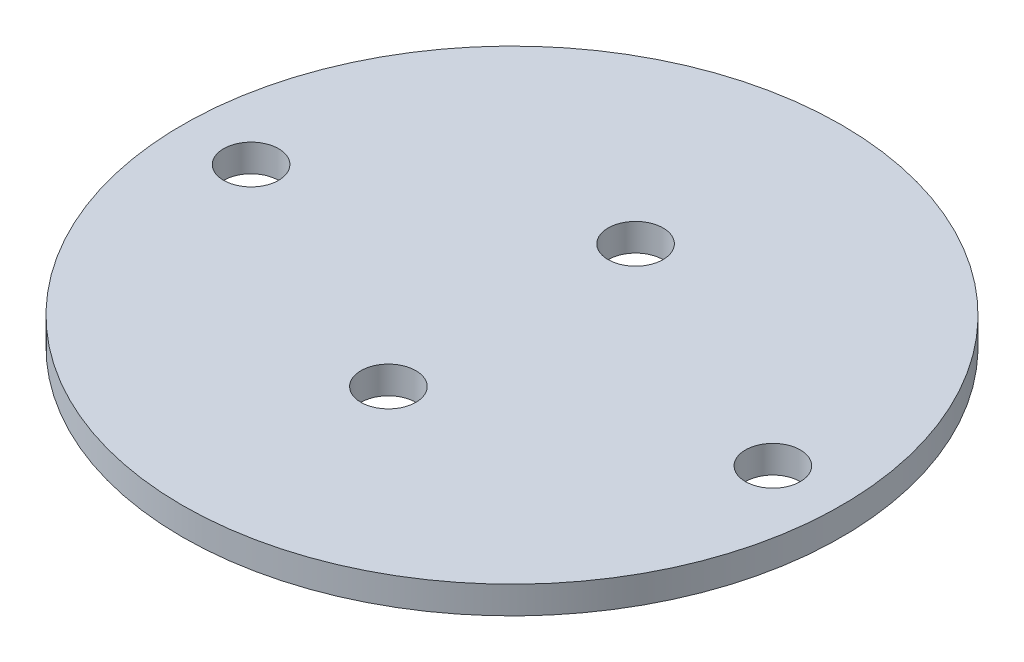
ISO-10303-21;
HEADER;
FILE_DESCRIPTION(('STEP AP214'),'2;1');
FILE_NAME('part.step','',(''),(''),'','','');
FILE_SCHEMA(('AUTOMOTIVE_DESIGN { 1 0 10303 214 1 1 1 1 }'));
ENDSEC;
DATA;
#1=APPLICATION_CONTEXT('core data for automotive mechanical design processes');
#2=APPLICATION_PROTOCOL_DEFINITION('international standard','automotive_design',2000,#1);
#3=PRODUCT_CONTEXT('',#1,'mechanical');
#4=PRODUCT('Part','Part','',(#3));
#5=PRODUCT_RELATED_PRODUCT_CATEGORY('part','',(#4));
#6=PRODUCT_DEFINITION_FORMATION('','',#4);
#7=PRODUCT_DEFINITION_CONTEXT('part definition',#1,'design');
#8=PRODUCT_DEFINITION('design','',#6,#7);
#9=PRODUCT_DEFINITION_SHAPE('','',#8);
#10=(LENGTH_UNIT() NAMED_UNIT(*) SI_UNIT(.MILLI.,.METRE.));
#11=(NAMED_UNIT(*) PLANE_ANGLE_UNIT() SI_UNIT($,.RADIAN.));
#12=(NAMED_UNIT(*) SI_UNIT($,.STERADIAN.) SOLID_ANGLE_UNIT());
#13=UNCERTAINTY_MEASURE_WITH_UNIT(LENGTH_MEASURE(1.E-05),#10,'distance_accuracy_value','');
#14=(GEOMETRIC_REPRESENTATION_CONTEXT(3) GLOBAL_UNCERTAINTY_ASSIGNED_CONTEXT((#13)) GLOBAL_UNIT_ASSIGNED_CONTEXT((#10,
#11,#12)) REPRESENTATION_CONTEXT('',''));
#15=CARTESIAN_POINT('',(0.,0.,0.));
#16=DIRECTION('',(0.,0.,1.));
#17=DIRECTION('',(1.,0.,0.));
#18=AXIS2_PLACEMENT_3D('',#15,#16,#17);
#19=CARTESIAN_POINT('',(32.4415047918678,-3.,0.));
#20=DIRECTION('',(0.,1.,0.));
#21=DIRECTION('',(0.,0.,1.));
#22=AXIS2_PLACEMENT_3D('',#19,#20,#21);
#23=CYLINDRICAL_SURFACE('',#22,3.);
#24=CARTESIAN_POINT('',(32.4415047918678,-3.,0.));
#25=DIRECTION('',(0.,1.,0.));
#26=DIRECTION('',(0.,0.,1.));
#27=AXIS2_PLACEMENT_3D('',#24,#25,#26);
#28=CIRCLE('',#27,3.);
#29=CARTESIAN_POINT('',(32.4415047918678,-3.,2.99999999999999));
#30=VERTEX_POINT('',#29);
#31=EDGE_CURVE('E46',#30,#30,#28,.T.);
#32=ORIENTED_EDGE('',*,*,#31,.F.);
#33=EDGE_LOOP('',(#32));
#34=FACE_BOUND('',#33,.T.);
#35=CARTESIAN_POINT('',(32.4415047918678,0.,0.));
#36=DIRECTION('',(0.,1.,0.));
#37=DIRECTION('',(0.,0.,1.));
#38=AXIS2_PLACEMENT_3D('',#35,#36,#37);
#39=CIRCLE('',#38,3.);
#40=CARTESIAN_POINT('',(32.4415047918678,0.,2.99999999999999));
#41=VERTEX_POINT('',#40);
#42=EDGE_CURVE('E67',#41,#41,#39,.T.);
#43=ORIENTED_EDGE('',*,*,#42,.T.);
#44=EDGE_LOOP('',(#43));
#45=FACE_BOUND('',#44,.T.);
#46=ADVANCED_FACE('F37',(#34,#45),#23,.F.);
#47=CARTESIAN_POINT('',(-24.5584952081322,-3.,0.));
#48=DIRECTION('',(0.,1.,0.));
#49=DIRECTION('',(0.,0.,1.));
#50=AXIS2_PLACEMENT_3D('',#47,#48,#49);
#51=CYLINDRICAL_SURFACE('',#50,3.);
#52=CARTESIAN_POINT('',(-24.5584952081322,-3.,0.));
#53=DIRECTION('',(0.,1.,0.));
#54=DIRECTION('',(0.,0.,1.));
#55=AXIS2_PLACEMENT_3D('',#52,#53,#54);
#56=CIRCLE('',#55,3.);
#57=CARTESIAN_POINT('',(-24.5584952081322,-3.,3.));
#58=VERTEX_POINT('',#57);
#59=EDGE_CURVE('E52',#58,#58,#56,.T.);
#60=ORIENTED_EDGE('',*,*,#59,.F.);
#61=EDGE_LOOP('',(#60));
#62=FACE_BOUND('',#61,.T.);
#63=CARTESIAN_POINT('',(-24.5584952081322,0.,0.));
#64=DIRECTION('',(0.,1.,0.));
#65=DIRECTION('',(0.,0.,1.));
#66=AXIS2_PLACEMENT_3D('',#63,#64,#65);
#67=CIRCLE('',#66,3.);
#68=CARTESIAN_POINT('',(-24.5584952081322,0.,3.));
#69=VERTEX_POINT('',#68);
#70=EDGE_CURVE('E64',#69,#69,#67,.T.);
#71=ORIENTED_EDGE('',*,*,#70,.T.);
#72=EDGE_LOOP('',(#71));
#73=FACE_BOUND('',#72,.T.);
#74=ADVANCED_FACE('F93',(#62,#73),#51,.F.);
#75=CARTESIAN_POINT('',(3.94150479186784,-3.,-13.5));
#76=DIRECTION('',(0.,1.,0.));
#77=DIRECTION('',(0.,0.,1.));
#78=AXIS2_PLACEMENT_3D('',#75,#76,#77);
#79=CYLINDRICAL_SURFACE('',#78,3.);
#80=CARTESIAN_POINT('',(3.94150479186784,-3.,-13.5));
#81=DIRECTION('',(0.,1.,0.));
#82=DIRECTION('',(0.,0.,1.));
#83=AXIS2_PLACEMENT_3D('',#80,#81,#82);
#84=CIRCLE('',#83,3.);
#85=CARTESIAN_POINT('',(3.94150479186784,-3.,-10.5));
#86=VERTEX_POINT('',#85);
#87=EDGE_CURVE('E79',#86,#86,#84,.T.);
#88=ORIENTED_EDGE('',*,*,#87,.F.);
#89=EDGE_LOOP('',(#88));
#90=FACE_BOUND('',#89,.T.);
#91=CARTESIAN_POINT('',(3.94150479186784,0.,-13.5));
#92=DIRECTION('',(0.,1.,0.));
#93=DIRECTION('',(0.,0.,1.));
#94=AXIS2_PLACEMENT_3D('',#91,#92,#93);
#95=CIRCLE('',#94,3.);
#96=CARTESIAN_POINT('',(3.94150479186784,0.,-10.5));
#97=VERTEX_POINT('',#96);
#98=EDGE_CURVE('E60',#97,#97,#95,.T.);
#99=ORIENTED_EDGE('',*,*,#98,.T.);
#100=EDGE_LOOP('',(#99));
#101=FACE_BOUND('',#100,.T.);
#102=ADVANCED_FACE('F96',(#90,#101),#79,.F.);
#103=CARTESIAN_POINT('',(3.94150479186784,-3.,13.5));
#104=DIRECTION('',(0.,1.,0.));
#105=DIRECTION('',(0.,0.,1.));
#106=AXIS2_PLACEMENT_3D('',#103,#104,#105);
#107=CYLINDRICAL_SURFACE('',#106,3.);
#108=CARTESIAN_POINT('',(3.94150479186784,-3.,13.5));
#109=DIRECTION('',(0.,1.,0.));
#110=DIRECTION('',(0.,0.,1.));
#111=AXIS2_PLACEMENT_3D('',#108,#109,#110);
#112=CIRCLE('',#111,3.);
#113=CARTESIAN_POINT('',(3.94150479186784,-3.,16.5));
#114=VERTEX_POINT('',#113);
#115=EDGE_CURVE('E74',#114,#114,#112,.T.);
#116=ORIENTED_EDGE('',*,*,#115,.F.);
#117=EDGE_LOOP('',(#116));
#118=FACE_BOUND('',#117,.T.);
#119=CARTESIAN_POINT('',(3.94150479186784,0.,13.5));
#120=DIRECTION('',(0.,1.,0.));
#121=DIRECTION('',(0.,0.,1.));
#122=AXIS2_PLACEMENT_3D('',#119,#120,#121);
#123=CIRCLE('',#122,3.);
#124=CARTESIAN_POINT('',(3.94150479186784,0.,16.5));
#125=VERTEX_POINT('',#124);
#126=EDGE_CURVE('E56',#125,#125,#123,.T.);
#127=ORIENTED_EDGE('',*,*,#126,.T.);
#128=EDGE_LOOP('',(#127));
#129=FACE_BOUND('',#128,.T.);
#130=ADVANCED_FACE('F39',(#118,#129),#107,.F.);
#131=CARTESIAN_POINT('',(3.94150479186784,-3.,0.));
#132=DIRECTION('',(0.,1.,0.));
#133=DIRECTION('',(0.,0.,1.));
#134=AXIS2_PLACEMENT_3D('',#131,#132,#133);
#135=CYLINDRICAL_SURFACE('',#134,36.);
#136=CARTESIAN_POINT('',(3.94150479186784,-3.,0.));
#137=DIRECTION('',(0.,1.,0.));
#138=DIRECTION('',(0.,0.,1.));
#139=AXIS2_PLACEMENT_3D('',#136,#137,#138);
#140=CIRCLE('',#139,36.);
#141=CARTESIAN_POINT('',(3.94150479186784,-3.,36.));
#142=VERTEX_POINT('',#141);
#143=EDGE_CURVE('E10',#142,#142,#140,.T.);
#144=ORIENTED_EDGE('',*,*,#143,.T.);
#145=EDGE_LOOP('',(#144));
#146=FACE_BOUND('',#145,.T.);
#147=CARTESIAN_POINT('',(3.94150479186784,0.,0.));
#148=DIRECTION('',(0.,1.,0.));
#149=DIRECTION('',(0.,0.,1.));
#150=AXIS2_PLACEMENT_3D('',#147,#148,#149);
#151=CIRCLE('',#150,36.);
#152=CARTESIAN_POINT('',(3.94150479186784,0.,36.));
#153=VERTEX_POINT('',#152);
#154=EDGE_CURVE('E41',#153,#153,#151,.T.);
#155=ORIENTED_EDGE('',*,*,#154,.F.);
#156=EDGE_LOOP('',(#155));
#157=FACE_BOUND('',#156,.T.);
#158=ADVANCED_FACE('F108',(#146,#157),#135,.T.);
#159=CARTESIAN_POINT('',(0.,-3.,0.));
#160=DIRECTION('',(0.,1.,0.));
#161=DIRECTION('',(0.,0.,1.));
#162=AXIS2_PLACEMENT_3D('',#159,#160,#161);
#163=PLANE('',#162);
#164=ORIENTED_EDGE('',*,*,#115,.T.);
#165=EDGE_LOOP('',(#164));
#166=FACE_BOUND('',#165,.T.);
#167=ORIENTED_EDGE('',*,*,#87,.T.);
#168=EDGE_LOOP('',(#167));
#169=FACE_BOUND('',#168,.T.);
#170=ORIENTED_EDGE('',*,*,#59,.T.);
#171=EDGE_LOOP('',(#170));
#172=FACE_BOUND('',#171,.T.);
#173=ORIENTED_EDGE('',*,*,#31,.T.);
#174=EDGE_LOOP('',(#173));
#175=FACE_BOUND('',#174,.T.);
#176=ORIENTED_EDGE('',*,*,#143,.F.);
#177=EDGE_LOOP('',(#176));
#178=FACE_BOUND('',#177,.T.);
#179=ADVANCED_FACE('F90',(#166,#169,#172,#175,#178),#163,.F.);
#180=CARTESIAN_POINT('',(0.,0.,0.));
#181=DIRECTION('',(0.,1.,0.));
#182=DIRECTION('',(0.,0.,1.));
#183=AXIS2_PLACEMENT_3D('',#180,#181,#182);
#184=PLANE('',#183);
#185=ORIENTED_EDGE('',*,*,#126,.F.);
#186=EDGE_LOOP('',(#185));
#187=FACE_BOUND('',#186,.T.);
#188=ORIENTED_EDGE('',*,*,#98,.F.);
#189=EDGE_LOOP('',(#188));
#190=FACE_BOUND('',#189,.T.);
#191=ORIENTED_EDGE('',*,*,#70,.F.);
#192=EDGE_LOOP('',(#191));
#193=FACE_BOUND('',#192,.T.);
#194=ORIENTED_EDGE('',*,*,#42,.F.);
#195=EDGE_LOOP('',(#194));
#196=FACE_BOUND('',#195,.T.);
#197=ORIENTED_EDGE('',*,*,#154,.T.);
#198=EDGE_LOOP('',(#197));
#199=FACE_BOUND('',#198,.T.);
#200=ADVANCED_FACE('F100',(#187,#190,#193,#196,#199),#184,.T.);
#201=CLOSED_SHELL('',(#46,#74,#102,#130,#158,#179,#200));
#202=MANIFOLD_SOLID_BREP('B2',#201);
#203=ADVANCED_BREP_SHAPE_REPRESENTATION('',(#18,#202),#14);
#204=SHAPE_DEFINITION_REPRESENTATION(#9,#203);
ENDSEC;
END-ISO-10303-21;
